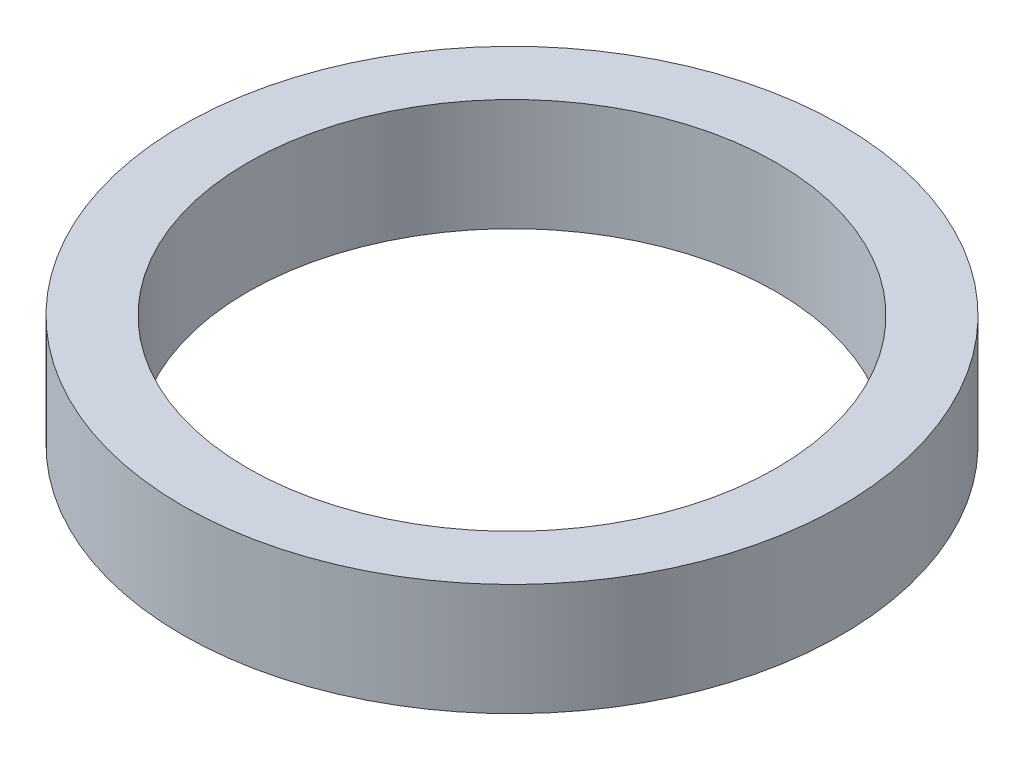
ISO-10303-21;
HEADER;
FILE_DESCRIPTION(('STEP AP214'),'2;1');
FILE_NAME('part.step','',(''),(''),'','','');
FILE_SCHEMA(('AUTOMOTIVE_DESIGN { 1 0 10303 214 1 1 1 1 }'));
ENDSEC;
DATA;
#1=APPLICATION_CONTEXT('core data for automotive mechanical design processes');
#2=APPLICATION_PROTOCOL_DEFINITION('international standard','automotive_design',2000,#1);
#3=PRODUCT_CONTEXT('',#1,'mechanical');
#4=PRODUCT('Part','Part','',(#3));
#5=PRODUCT_RELATED_PRODUCT_CATEGORY('part','',(#4));
#6=PRODUCT_DEFINITION_FORMATION('','',#4);
#7=PRODUCT_DEFINITION_CONTEXT('part definition',#1,'design');
#8=PRODUCT_DEFINITION('design','',#6,#7);
#9=PRODUCT_DEFINITION_SHAPE('','',#8);
#10=(LENGTH_UNIT() NAMED_UNIT(*) SI_UNIT(.MILLI.,.METRE.));
#11=(NAMED_UNIT(*) PLANE_ANGLE_UNIT() SI_UNIT($,.RADIAN.));
#12=(NAMED_UNIT(*) SI_UNIT($,.STERADIAN.) SOLID_ANGLE_UNIT());
#13=UNCERTAINTY_MEASURE_WITH_UNIT(LENGTH_MEASURE(1.E-05),#10,'distance_accuracy_value','');
#14=(GEOMETRIC_REPRESENTATION_CONTEXT(3) GLOBAL_UNCERTAINTY_ASSIGNED_CONTEXT((#13)) GLOBAL_UNIT_ASSIGNED_CONTEXT((#10,
#11,#12)) REPRESENTATION_CONTEXT('',''));
#15=CARTESIAN_POINT('',(0.,0.,0.));
#16=DIRECTION('',(0.,0.,1.));
#17=DIRECTION('',(1.,0.,0.));
#18=AXIS2_PLACEMENT_3D('',#15,#16,#17);
#19=CARTESIAN_POINT('',(0.,5.5,0.));
#20=DIRECTION('',(0.,1.,0.));
#21=DIRECTION('',(0.,0.,1.));
#22=AXIS2_PLACEMENT_3D('',#19,#20,#21);
#23=PLANE('',#22);
#24=CARTESIAN_POINT('',(0.,5.5,0.));
#25=DIRECTION('',(0.,1.,0.));
#26=DIRECTION('',(0.,0.,1.));
#27=AXIS2_PLACEMENT_3D('',#24,#25,#26);
#28=CIRCLE('',#27,16.2);
#29=CARTESIAN_POINT('',(0.,5.5,16.2));
#30=VERTEX_POINT('',#29);
#31=EDGE_CURVE('E10',#30,#30,#28,.T.);
#32=ORIENTED_EDGE('',*,*,#31,.T.);
#33=EDGE_LOOP('',(#32));
#34=FACE_BOUND('',#33,.T.);
#35=CARTESIAN_POINT('',(0.,5.5,0.));
#36=DIRECTION('',(0.,1.,0.));
#37=DIRECTION('',(0.,0.,1.));
#38=AXIS2_PLACEMENT_3D('',#35,#36,#37);
#39=CIRCLE('',#38,13.);
#40=CARTESIAN_POINT('',(0.,5.5,13.));
#41=VERTEX_POINT('',#40);
#42=EDGE_CURVE('E42',#41,#41,#39,.T.);
#43=ORIENTED_EDGE('',*,*,#42,.F.);
#44=EDGE_LOOP('',(#43));
#45=FACE_BOUND('',#44,.T.);
#46=ADVANCED_FACE('F31',(#34,#45),#23,.T.);
#47=CARTESIAN_POINT('',(0.,0.,0.));
#48=DIRECTION('',(0.,1.,0.));
#49=DIRECTION('',(0.,0.,1.));
#50=AXIS2_PLACEMENT_3D('',#47,#48,#49);
#51=PLANE('',#50);
#52=CARTESIAN_POINT('',(0.,0.,0.));
#53=DIRECTION('',(0.,1.,0.));
#54=DIRECTION('',(0.,0.,1.));
#55=AXIS2_PLACEMENT_3D('',#52,#53,#54);
#56=CIRCLE('',#55,16.2);
#57=CARTESIAN_POINT('',(0.,0.,16.2));
#58=VERTEX_POINT('',#57);
#59=EDGE_CURVE('E35',#58,#58,#56,.T.);
#60=ORIENTED_EDGE('',*,*,#59,.F.);
#61=EDGE_LOOP('',(#60));
#62=FACE_BOUND('',#61,.T.);
#63=CARTESIAN_POINT('',(0.,0.,0.));
#64=DIRECTION('',(0.,1.,0.));
#65=DIRECTION('',(0.,0.,1.));
#66=AXIS2_PLACEMENT_3D('',#63,#64,#65);
#67=CIRCLE('',#66,13.);
#68=CARTESIAN_POINT('',(0.,0.,13.));
#69=VERTEX_POINT('',#68);
#70=EDGE_CURVE('E44',#69,#69,#67,.T.);
#71=ORIENTED_EDGE('',*,*,#70,.T.);
#72=EDGE_LOOP('',(#71));
#73=FACE_BOUND('',#72,.T.);
#74=ADVANCED_FACE('F54',(#62,#73),#51,.F.);
#75=CARTESIAN_POINT('',(0.,5.5,0.));
#76=DIRECTION('',(0.,-1.,0.));
#77=DIRECTION('',(0.,0.,-1.));
#78=AXIS2_PLACEMENT_3D('',#75,#76,#77);
#79=CYLINDRICAL_SURFACE('',#78,16.2);
#80=ORIENTED_EDGE('',*,*,#31,.F.);
#81=EDGE_LOOP('',(#80));
#82=FACE_BOUND('',#81,.T.);
#83=ORIENTED_EDGE('',*,*,#59,.T.);
#84=EDGE_LOOP('',(#83));
#85=FACE_BOUND('',#84,.T.);
#86=ADVANCED_FACE('F33',(#82,#85),#79,.T.);
#87=CARTESIAN_POINT('',(0.,5.5,0.));
#88=DIRECTION('',(0.,-1.,0.));
#89=DIRECTION('',(0.,0.,-1.));
#90=AXIS2_PLACEMENT_3D('',#87,#88,#89);
#91=CYLINDRICAL_SURFACE('',#90,13.);
#92=ORIENTED_EDGE('',*,*,#42,.T.);
#93=EDGE_LOOP('',(#92));
#94=FACE_BOUND('',#93,.T.);
#95=ORIENTED_EDGE('',*,*,#70,.F.);
#96=EDGE_LOOP('',(#95));
#97=FACE_BOUND('',#96,.T.);
#98=ADVANCED_FACE('F50',(#94,#97),#91,.F.);
#99=CLOSED_SHELL('',(#46,#74,#86,#98));
#100=MANIFOLD_SOLID_BREP('B2',#99);
#101=ADVANCED_BREP_SHAPE_REPRESENTATION('',(#18,#100),#14);
#102=SHAPE_DEFINITION_REPRESENTATION(#9,#101);
ENDSEC;
END-ISO-10303-21;
